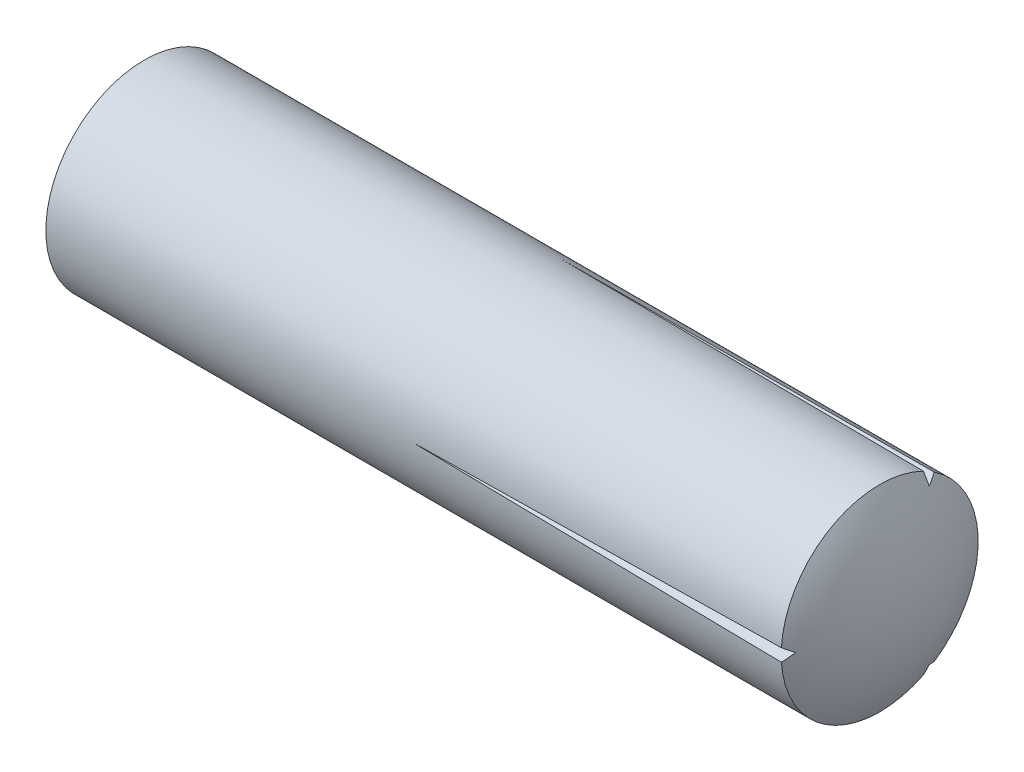
ISO-10303-21;
HEADER;
FILE_DESCRIPTION(('STEP AP214'),'2;1');
FILE_NAME('part.step','',(''),(''),'','','');
FILE_SCHEMA(('AUTOMOTIVE_DESIGN { 1 0 10303 214 1 1 1 1 }'));
ENDSEC;
DATA;
#1=APPLICATION_CONTEXT('core data for automotive mechanical design processes');
#2=APPLICATION_PROTOCOL_DEFINITION('international standard','automotive_design',2000,#1);
#3=PRODUCT_CONTEXT('',#1,'mechanical');
#4=PRODUCT('Part','Part','',(#3));
#5=PRODUCT_RELATED_PRODUCT_CATEGORY('part','',(#4));
#6=PRODUCT_DEFINITION_FORMATION('','',#4);
#7=PRODUCT_DEFINITION_CONTEXT('part definition',#1,'design');
#8=PRODUCT_DEFINITION('design','',#6,#7);
#9=PRODUCT_DEFINITION_SHAPE('','',#8);
#10=(LENGTH_UNIT() NAMED_UNIT(*) SI_UNIT(.MILLI.,.METRE.));
#11=(NAMED_UNIT(*) PLANE_ANGLE_UNIT() SI_UNIT($,.RADIAN.));
#12=(NAMED_UNIT(*) SI_UNIT($,.STERADIAN.) SOLID_ANGLE_UNIT());
#13=UNCERTAINTY_MEASURE_WITH_UNIT(LENGTH_MEASURE(1.E-05),#10,'distance_accuracy_value','');
#14=(GEOMETRIC_REPRESENTATION_CONTEXT(3) GLOBAL_UNCERTAINTY_ASSIGNED_CONTEXT((#13)) GLOBAL_UNIT_ASSIGNED_CONTEXT((#10,
#11,#12)) REPRESENTATION_CONTEXT('',''));
#15=CARTESIAN_POINT('',(0.,0.,0.));
#16=DIRECTION('',(0.,0.,1.));
#17=DIRECTION('',(1.,0.,0.));
#18=AXIS2_PLACEMENT_3D('',#15,#16,#17);
#19=CARTESIAN_POINT('',(-25.,0.,0.));
#20=DIRECTION('',(-1.,0.,0.));
#21=DIRECTION('',(0.,1.,0.));
#22=AXIS2_PLACEMENT_3D('',#19,#20,#21);
#23=SPHERICAL_SURFACE('',#22,25.);
#24=CARTESIAN_POINT('',(-24.9023511934461,6.17179285381206,2.87795427227892));
#25=DIRECTION('',(-0.0143379369105312,-0.906214624486526,-0.422574819330133));
#26=DIRECTION('',(0.,0.422618261740707,-0.906307787036646));
#27=AXIS2_PLACEMENT_3D('',#24,#25,#26);
#28=CIRCLE('',#27,24.0544552398695);
#29=CARTESIAN_POINT('',(-3.34936490538902,10.4038239468317,-6.92895715698489));
#30=VERTEX_POINT('',#29);
#31=CARTESIAN_POINT('',(-2.70853608787133,9.80142731905408,-5.65885670109831));
#32=VERTEX_POINT('',#31);
#33=EDGE_CURVE('E46',#30,#32,#28,.T.);
#34=ORIENTED_EDGE('',*,*,#33,.T.);
#35=CARTESIAN_POINT('',(-24.9023511934461,0.593514916182661,-6.78390653443597));
#36=DIRECTION('',(-0.0143379369105313,-0.0871467837037696,0.996092295751372));
#37=DIRECTION('',(0.,-0.996194698091744,-0.0871557427476708));
#38=AXIS2_PLACEMENT_3D('',#35,#36,#37);
#39=CIRCLE('',#38,24.0544552398695);
#40=CARTESIAN_POINT('',(-3.34936490538905,11.2025648930988,-5.54549725596445));
#41=VERTEX_POINT('',#40);
#42=EDGE_CURVE('E92',#32,#41,#39,.T.);
#43=ORIENTED_EDGE('',*,*,#42,.T.);
#44=CARTESIAN_POINT('',(-3.34936490538904,0.,0.));
#45=DIRECTION('',(-1.,0.,0.));
#46=DIRECTION('',(0.,0.,1.));
#47=AXIS2_PLACEMENT_3D('',#44,#45,#46);
#48=CIRCLE('',#47,12.5);
#49=CARTESIAN_POINT('',(-3.34936490538908,0.798740946267198,12.4744544129495));
#50=VERTEX_POINT('',#49);
#51=EDGE_CURVE('E99',#50,#41,#48,.T.);
#52=ORIENTED_EDGE('',*,*,#51,.F.);
#53=CARTESIAN_POINT('',(-24.9023511934461,-5.5782779376295,3.90595226215709));
#54=DIRECTION('',(-0.0143379369105312,0.819067840782772,-0.573517476421249));
#55=DIRECTION('',(0.,0.573576436351047,0.819152044288991));
#56=AXIS2_PLACEMENT_3D('',#53,#54,#55);
#57=CIRCLE('',#56,24.0544552398695);
#58=CARTESIAN_POINT('',(-2.70853608787132,0.,11.3177134021968));
#59=VERTEX_POINT('',#58);
#60=EDGE_CURVE('E123',#50,#59,#57,.T.);
#61=ORIENTED_EDGE('',*,*,#60,.T.);
#62=CARTESIAN_POINT('',(-24.9023511934461,5.5782779376295,3.90595226215713));
#63=DIRECTION('',(-0.0143379369105313,-0.819067840782771,-0.57351747642125));
#64=DIRECTION('',(0.,0.573576436351049,-0.81915204428899));
#65=AXIS2_PLACEMENT_3D('',#62,#63,#64);
#66=CIRCLE('',#65,24.0544552398695);
#67=CARTESIAN_POINT('',(-3.34936490538905,-0.798740946267202,12.4744544129495));
#68=VERTEX_POINT('',#67);
#69=EDGE_CURVE('E118',#59,#68,#66,.T.);
#70=ORIENTED_EDGE('',*,*,#69,.T.);
#71=CARTESIAN_POINT('',(-3.34936490538905,-11.2025648930988,-5.54549725596461));
#72=VERTEX_POINT('',#71);
#73=EDGE_CURVE('E106',#72,#68,#48,.T.);
#74=ORIENTED_EDGE('',*,*,#73,.F.);
#75=CARTESIAN_POINT('',(-24.9023511934461,-0.593514916182572,-6.78390653443596));
#76=DIRECTION('',(-0.0143379369105312,0.0871467837037535,0.996092295751373));
#77=DIRECTION('',(0.,-0.996194698091746,0.0871557427476547));
#78=AXIS2_PLACEMENT_3D('',#75,#76,#77);
#79=CIRCLE('',#78,24.0544552398695);
#80=CARTESIAN_POINT('',(-2.70853608787131,-9.801427319054,-5.65885670109844));
#81=VERTEX_POINT('',#80);
#82=EDGE_CURVE('E54',#72,#81,#79,.T.);
#83=ORIENTED_EDGE('',*,*,#82,.T.);
#84=CARTESIAN_POINT('',(-24.9023511934461,-6.17179285381213,2.87795427227883));
#85=DIRECTION('',(-0.0143379369105313,0.906214624486533,-0.422574819330118));
#86=DIRECTION('',(0.,0.422618261740692,0.906307787036653));
#87=AXIS2_PLACEMENT_3D('',#84,#85,#86);
#88=CIRCLE('',#87,24.0544552398695);
#89=CARTESIAN_POINT('',(-3.34936490538905,-10.4038239468316,-6.92895715698503));
#90=VERTEX_POINT('',#89);
#91=EDGE_CURVE('E128',#81,#90,#88,.T.);
#92=ORIENTED_EDGE('',*,*,#91,.T.);
#93=EDGE_CURVE('E104',#30,#90,#48,.T.);
#94=ORIENTED_EDGE('',*,*,#93,.F.);
#95=EDGE_LOOP('',(#34,#43,#52,#61,#70,#74,#83,#92,#94));
#96=FACE_BOUND('',#95,.T.);
#97=ADVANCED_FACE('F32',(#96),#23,.T.);
#98=CARTESIAN_POINT('',(-40.,0.,0.));
#99=DIRECTION('',(-1.,0.,0.));
#100=DIRECTION('',(0.,0.,1.));
#101=AXIS2_PLACEMENT_3D('',#98,#99,#100);
#102=CYLINDRICAL_SURFACE('',#101,12.5);
#103=ORIENTED_EDGE('',*,*,#51,.T.);
#104=CARTESIAN_POINT('',(450.,0.,0.));
#105=DIRECTION('',(-0.0143379369105313,-0.0871467837037696,0.996092295751372));
#106=DIRECTION('',(-0.999897206499323,0.0012496335409066,-0.0142833767318452));
#107=AXIS2_PLACEMENT_3D('',#104,#105,#106);
#108=ELLIPSE('',#107,871.813014522243,12.5);
#109=CARTESIAN_POINT('',(-50.,10.8253175473055,-6.2499999999999));
#110=VERTEX_POINT('',#109);
#111=EDGE_CURVE('E11',#41,#110,#108,.T.);
#112=ORIENTED_EDGE('',*,*,#111,.T.);
#113=CARTESIAN_POINT('',(449.999999999999,0.,0.));
#114=DIRECTION('',(-0.0143379369105312,-0.906214624486526,-0.422574819330133));
#115=DIRECTION('',(-0.999897206499323,0.0129945838720546,0.00605947397407663));
#116=AXIS2_PLACEMENT_3D('',#113,#114,#115);
#117=ELLIPSE('',#116,871.813014522245,12.5);
#118=EDGE_CURVE('E39',#110,#30,#117,.T.);
#119=ORIENTED_EDGE('',*,*,#118,.T.);
#120=ORIENTED_EDGE('',*,*,#93,.T.);
#121=CARTESIAN_POINT('',(450.,0.,0.));
#122=DIRECTION('',(-0.0143379369105313,0.906214624486533,-0.422574819330118));
#123=DIRECTION('',(-0.999897206499323,-0.0129945838720548,0.00605947397407644));
#124=AXIS2_PLACEMENT_3D('',#121,#122,#123);
#125=ELLIPSE('',#124,871.813014522242,12.5);
#126=CARTESIAN_POINT('',(-50.,-10.8253175473055,-6.25000000000005));
#127=VERTEX_POINT('',#126);
#128=EDGE_CURVE('E88',#90,#127,#125,.T.);
#129=ORIENTED_EDGE('',*,*,#128,.T.);
#130=CARTESIAN_POINT('',(450.,0.,0.));
#131=DIRECTION('',(-0.0143379369105312,0.0871467837037535,0.996092295751373));
#132=DIRECTION('',(-0.999897206499323,-0.00124963354090636,-0.0142833767318452));
#133=AXIS2_PLACEMENT_3D('',#130,#131,#132);
#134=ELLIPSE('',#133,871.813014522245,12.5);
#135=EDGE_CURVE('E140',#127,#72,#134,.T.);
#136=ORIENTED_EDGE('',*,*,#135,.T.);
#137=ORIENTED_EDGE('',*,*,#73,.T.);
#138=CARTESIAN_POINT('',(450.,0.,0.));
#139=DIRECTION('',(-0.0143379369105313,-0.819067840782771,-0.57351747642125));
#140=DIRECTION('',(-0.999897206499323,0.0117449503311483,0.00822390275776869));
#141=AXIS2_PLACEMENT_3D('',#138,#139,#140);
#142=ELLIPSE('',#141,871.813014522242,12.5);
#143=CARTESIAN_POINT('',(-50.,0.,12.5));
#144=VERTEX_POINT('',#143);
#145=EDGE_CURVE('E107',#68,#144,#142,.T.);
#146=ORIENTED_EDGE('',*,*,#145,.T.);
#147=CARTESIAN_POINT('',(450.,0.,0.));
#148=DIRECTION('',(-0.0143379369105312,0.819067840782772,-0.573517476421249));
#149=DIRECTION('',(-0.999897206499323,-0.0117449503311482,0.00822390275776864));
#150=AXIS2_PLACEMENT_3D('',#147,#148,#149);
#151=ELLIPSE('',#150,871.813014522245,12.5);
#152=EDGE_CURVE('E101',#144,#50,#151,.T.);
#153=ORIENTED_EDGE('',*,*,#152,.T.);
#154=EDGE_LOOP('',(#103,#112,#119,#120,#129,#136,#137,#146,#153));
#155=FACE_BOUND('',#154,.T.);
#156=CARTESIAN_POINT('',(-96.6819046503132,0.,0.));
#157=DIRECTION('',(-1.,0.,0.));
#158=DIRECTION('',(0.,0.,1.));
#159=AXIS2_PLACEMENT_3D('',#156,#157,#158);
#160=CIRCLE('',#159,12.5);
#161=CARTESIAN_POINT('',(-96.6819046503132,12.5,0.));
#162=VERTEX_POINT('',#161);
#163=EDGE_CURVE('E110',#162,#162,#160,.T.);
#164=ORIENTED_EDGE('',*,*,#163,.F.);
#165=EDGE_LOOP('',(#164));
#166=FACE_BOUND('',#165,.T.);
#167=ADVANCED_FACE('F95',(#155,#166),#102,.T.);
#168=CARTESIAN_POINT('',(-75.0312695557023,0.,0.));
#169=DIRECTION('',(-1.,0.,0.));
#170=DIRECTION('',(0.,1.,0.));
#171=AXIS2_PLACEMENT_3D('',#168,#169,#170);
#172=SPHERICAL_SURFACE('',#171,25.);
#173=CARTESIAN_POINT('',(-100.,0.,0.));
#174=DIRECTION('',(-1.,0.,0.));
#175=DIRECTION('',(0.,0.,1.));
#176=AXIS2_PLACEMENT_3D('',#173,#174,#175);
#177=CIRCLE('',#176,1.25);
#178=CARTESIAN_POINT('',(-100.,1.25000000000035,0.));
#179=VERTEX_POINT('',#178);
#180=EDGE_CURVE('E114',#179,#179,#177,.T.);
#181=CARTESIAN_POINT('',(-100.,1.25000000000035,0.));
#182=CARTESIAN_POINT('',(-99.9938336924778,1.37317333168672,0.));
#183=CARTESIAN_POINT('',(-99.9867558041352,1.4963010254091,0.));
#184=CARTESIAN_POINT('',(-99.9707787305738,1.74243819046368,0.));
#185=CARTESIAN_POINT('',(-99.9618795453548,1.86544766179588,0.));
#186=CARTESIAN_POINT('',(-99.942261742805,2.11132143560789,0.));
#187=CARTESIAN_POINT('',(-99.931543125474,2.23418573808771,0.));
#188=CARTESIAN_POINT('',(-99.9082888288313,2.47974226646491,0.));
#189=CARTESIAN_POINT('',(-99.8957531495194,2.60243449236229,0.));
#190=CARTESIAN_POINT('',(-99.8688674683718,2.84761999567298,0.));
#191=CARTESIAN_POINT('',(-99.854517466536,2.9701132730863,0.));
#192=CARTESIAN_POINT('',(-99.8240062848361,3.2148740515982,0.));
#193=CARTESIAN_POINT('',(-99.8078451049719,3.33714155269677,0.));
#194=CARTESIAN_POINT('',(-99.7737151063308,3.58142400006358,0.));
#195=CARTESIAN_POINT('',(-99.7557462875539,3.7034389463318,0.));
#196=CARTESIAN_POINT('',(-99.718004946655,3.94718956087147,0.));
#197=CARTESIAN_POINT('',(-99.698232424533,4.06892522914292,0.));
#198=CARTESIAN_POINT('',(-99.6568880074031,4.31209062567928,0.));
#199=CARTESIAN_POINT('',(-99.6353161123952,4.43352035394419,0.));
#200=CARTESIAN_POINT('',(-99.5903776740829,4.67604727546591,0.));
#201=CARTESIAN_POINT('',(-99.5670111307785,4.79714446872271,0.));
#202=CARTESIAN_POINT('',(-99.5184885135078,5.0389797980563,0.));
#203=CARTESIAN_POINT('',(-99.4933324395417,5.15971793413308,0.));
#204=CARTESIAN_POINT('',(-99.4412362705202,5.40080870557401,0.));
#205=CARTESIAN_POINT('',(-99.4142961754649,5.52116134093816,0.));
#206=CARTESIAN_POINT('',(-99.3586378645657,5.76145475185184,0.));
#207=CARTESIAN_POINT('',(-99.3299196487216,5.88139552740136,0.));
#208=CARTESIAN_POINT('',(-99.2707113859815,6.1208389497875,0.));
#209=CARTESIAN_POINT('',(-99.2402213390854,6.24034159662412,0.));
#210=CARTESIAN_POINT('',(-99.1774760920363,6.4788825886432,0.));
#211=CARTESIAN_POINT('',(-99.1452208918834,6.59792093382565,0.));
#212=CARTESIAN_POINT('',(-99.078952402712,6.83550725128444,0.));
#213=CARTESIAN_POINT('',(-99.0449391136935,6.95405522356077,0.));
#214=CARTESIAN_POINT('',(-98.9751618962311,7.19063483135464,0.));
#215=CARTESIAN_POINT('',(-98.9393979677872,7.30866646687218,0.));
#216=CARTESIAN_POINT('',(-98.8661273043316,7.54418755038161,0.));
#217=CARTESIAN_POINT('',(-98.8286205693198,7.6616769983735,0.));
#218=CARTESIAN_POINT('',(-98.7518725072874,7.89608797481227,0.));
#219=CARTESIAN_POINT('',(-98.7126311802669,8.01300950325915,0.));
#220=CARTESIAN_POINT('',(-98.6324225286792,8.24625903297179,0.));
#221=CARTESIAN_POINT('',(-98.5914552041119,8.36258703423754,0.));
#222=CARTESIAN_POINT('',(-98.5078035299129,8.59462403194348,0.));
#223=CARTESIAN_POINT('',(-98.4651191802811,8.71033302838366,0.));
#224=CARTESIAN_POINT('',(-98.3780428044906,8.94110667436581,0.));
#225=CARTESIAN_POINT('',(-98.3336507783319,9.05617132390777,0.));
#226=CARTESIAN_POINT('',(-98.2431687720324,9.28563107514246,0.));
#227=CARTESIAN_POINT('',(-98.1970787918916,9.40002617683519,0.));
#228=CARTESIAN_POINT('',(-98.1032109720533,9.62812177806321,0.));
#229=CARTESIAN_POINT('',(-98.055433132356,9.74182227759849,0.));
#230=CARTESIAN_POINT('',(-97.9582000574885,9.96850377232692,0.));
#231=CARTESIAN_POINT('',(-97.9087448223184,10.0814847675201,0.));
#232=CARTESIAN_POINT('',(-97.8081677879997,10.3067025089815,0.));
#233=CARTESIAN_POINT('',(-97.7570459888512,10.4189392552497,0.));
#234=CARTESIAN_POINT('',(-97.653147022944,10.6426439172087,0.));
#235=CARTESIAN_POINT('',(-97.6003698561855,10.7541118328994,0.));
#236=CARTESIAN_POINT('',(-97.4931717144603,10.9762544207054,0.));
#237=CARTESIAN_POINT('',(-97.4387507394937,11.0869290928207,0.));
#238=CARTESIAN_POINT('',(-97.3282768989746,11.307460953207,0.));
#239=CARTESIAN_POINT('',(-97.272224033422,11.417318141478,0.));
#240=CARTESIAN_POINT('',(-97.1584986934783,11.6361909766945,0.));
#241=CARTESIAN_POINT('',(-97.1008262190871,11.74520662364,0.));
#242=CARTESIAN_POINT('',(-96.9838742728691,11.9623724890546,0.));
#243=CARTESIAN_POINT('',(-96.9245948010422,12.0705227075237,0.));
#244=CARTESIAN_POINT('',(-96.8044419168537,12.2859340705523,0.));
#245=CARTESIAN_POINT('',(-96.743568504492,12.3931952151119,0.));
#246=CARTESIAN_POINT('',(-96.6819046503132,12.5,0.));
#247=B_SPLINE_CURVE_WITH_KNOTS('',3,(#181,#182,#183,#184,#185,#186,#187,#188,#189,#190,#191,
#192,#193,#194,#195,#196,#197,#198,#199,#200,#201,#202,#203,#204,#205,#206,#207,#208,#209,#210,
#211,#212,#213,#214,#215,#216,#217,#218,#219,#220,#221,#222,#223,#224,#225,#226,#227,#228,#229,
#230,#231,#232,#233,#234,#235,#236,#237,#238,#239,#240,#241,#242,#243,#244,#245,#246),
.UNSPECIFIED.,.F.,.F.,(4,2,2,2,2,2,2,2,2,2,2,2,2,2,2,2,2,2,2,2,2,2,2,2,2,2,2,2,2,2,2,2,4),(0.,
0.369979372671537,0.739958745343075,1.10993811801462,1.47991749068616,1.84989686335769,
2.21987623602923,2.58985560870077,2.95983498137231,3.32981435404385,3.69979372671539,
4.06977309938693,4.43975247205846,4.80973184473,5.17971121740154,5.54969059007308,
5.91966996274462,6.28964933541616,6.6596287080877,7.02960808075924,7.39958745343078,
7.76956682610231,8.13954619877385,8.50952557144539,8.87950494411693,9.24948431678847,
9.61946368946001,9.98944306213155,10.3594224348031,10.7294018074746,11.0993811801462,
11.4693605528177,11.8393399254892),.UNSPECIFIED.);
#248=EDGE_CURVE('BSEAM163',#179,#162,#247,.T.);
#249=ORIENTED_EDGE('',*,*,#180,.F.);
#250=ORIENTED_EDGE('',*,*,#163,.T.);
#251=ORIENTED_EDGE('',*,*,#248,.T.);
#252=ORIENTED_EDGE('',*,*,#248,.F.);
#253=EDGE_LOOP('',(#249,#251,#250,#252));
#254=FACE_BOUND('',#253,.T.);
#255=ADVANCED_FACE('F163',(#254),#172,.T.);
#256=CARTESIAN_POINT('',(-100.,0.,0.));
#257=DIRECTION('',(1.,0.,0.));
#258=DIRECTION('',(0.,0.,-1.));
#259=AXIS2_PLACEMENT_3D('',#256,#257,#258);
#260=PLANE('',#259);
#261=ORIENTED_EDGE('',*,*,#180,.T.);
#262=EDGE_LOOP('',(#261));
#263=FACE_BOUND('',#262,.T.);
#264=ADVANCED_FACE('F157',(#263),#260,.F.);
#265=CARTESIAN_POINT('',(-50.,0.,12.5));
#266=DIRECTION('',(-0.0143379369105313,-0.819067840782771,-0.57351747642125));
#267=DIRECTION('',(0.,0.573576436351049,-0.81915204428899));
#268=AXIS2_PLACEMENT_3D('',#265,#266,#267);
#269=PLANE('',#268);
#270=DIRECTION('',(0.999687646408123,0.,-0.0249921911602031));
#271=VECTOR('',#270,1.);
#272=CARTESIAN_POINT('',(-50.,0.,12.5));
#273=LINE('',#272,#271);
#274=EDGE_CURVE('E125',#144,#59,#273,.T.);
#275=ORIENTED_EDGE('',*,*,#274,.F.);
#276=ORIENTED_EDGE('',*,*,#145,.F.);
#277=ORIENTED_EDGE('',*,*,#69,.F.);
#278=EDGE_LOOP('',(#275,#276,#277));
#279=FACE_BOUND('',#278,.T.);
#280=ADVANCED_FACE('F146',(#279),#269,.F.);
#281=CARTESIAN_POINT('',(-50.,0.,12.5));
#282=DIRECTION('',(-0.0143379369105312,0.819067840782772,-0.573517476421249));
#283=DIRECTION('',(0.,0.573576436351047,0.819152044288991));
#284=AXIS2_PLACEMENT_3D('',#281,#282,#283);
#285=PLANE('',#284);
#286=ORIENTED_EDGE('',*,*,#152,.F.);
#287=ORIENTED_EDGE('',*,*,#274,.T.);
#288=ORIENTED_EDGE('',*,*,#60,.F.);
#289=EDGE_LOOP('',(#286,#287,#288));
#290=FACE_BOUND('',#289,.T.);
#291=ADVANCED_FACE('F148',(#290),#285,.F.);
#292=CARTESIAN_POINT('',(-50.,-10.8253175473055,-6.25000000000005));
#293=DIRECTION('',(-0.0143379369105313,0.906214624486533,-0.422574819330118));
#294=DIRECTION('',(0.,0.422618261740692,0.906307787036653));
#295=AXIS2_PLACEMENT_3D('',#292,#293,#294);
#296=PLANE('',#295);
#297=DIRECTION('',(0.999687646408123,0.0216438724409727,0.0124960955801016));
#298=VECTOR('',#297,1.);
#299=CARTESIAN_POINT('',(-50.,-10.8253175473055,-6.25000000000005));
#300=LINE('',#299,#298);
#301=EDGE_CURVE('E132',#127,#81,#300,.T.);
#302=ORIENTED_EDGE('',*,*,#301,.F.);
#303=ORIENTED_EDGE('',*,*,#128,.F.);
#304=ORIENTED_EDGE('',*,*,#91,.F.);
#305=EDGE_LOOP('',(#302,#303,#304));
#306=FACE_BOUND('',#305,.T.);
#307=ADVANCED_FACE('F139',(#306),#296,.F.);
#308=CARTESIAN_POINT('',(-50.,-10.8253175473055,-6.25000000000005));
#309=DIRECTION('',(-0.0143379369105312,0.0871467837037535,0.996092295751373));
#310=DIRECTION('',(0.,-0.996194698091746,0.0871557427476547));
#311=AXIS2_PLACEMENT_3D('',#308,#309,#310);
#312=PLANE('',#311);
#313=ORIENTED_EDGE('',*,*,#135,.F.);
#314=ORIENTED_EDGE('',*,*,#301,.T.);
#315=ORIENTED_EDGE('',*,*,#82,.F.);
#316=EDGE_LOOP('',(#313,#314,#315));
#317=FACE_BOUND('',#316,.T.);
#318=ADVANCED_FACE('F155',(#317),#312,.F.);
#319=CARTESIAN_POINT('',(-50.,10.8253175473055,-6.2499999999999));
#320=DIRECTION('',(-0.0143379369105313,-0.0871467837037696,0.996092295751372));
#321=DIRECTION('',(0.,-0.996194698091744,-0.0871557427476708));
#322=AXIS2_PLACEMENT_3D('',#319,#320,#321);
#323=PLANE('',#322);
#324=DIRECTION('',(0.999687646408123,-0.0216438724409729,0.0124960955801013));
#325=VECTOR('',#324,1.);
#326=CARTESIAN_POINT('',(-50.,10.8253175473055,-6.2499999999999));
#327=LINE('',#326,#325);
#328=EDGE_CURVE('E85',#110,#32,#327,.T.);
#329=ORIENTED_EDGE('',*,*,#328,.F.);
#330=ORIENTED_EDGE('',*,*,#111,.F.);
#331=ORIENTED_EDGE('',*,*,#42,.F.);
#332=EDGE_LOOP('',(#329,#330,#331));
#333=FACE_BOUND('',#332,.T.);
#334=ADVANCED_FACE('F90',(#333),#323,.F.);
#335=CARTESIAN_POINT('',(-50.,10.8253175473055,-6.2499999999999));
#336=DIRECTION('',(-0.0143379369105312,-0.906214624486526,-0.422574819330133));
#337=DIRECTION('',(0.,0.422618261740707,-0.906307787036646));
#338=AXIS2_PLACEMENT_3D('',#335,#336,#337);
#339=PLANE('',#338);
#340=ORIENTED_EDGE('',*,*,#118,.F.);
#341=ORIENTED_EDGE('',*,*,#328,.T.);
#342=ORIENTED_EDGE('',*,*,#33,.F.);
#343=EDGE_LOOP('',(#340,#341,#342));
#344=FACE_BOUND('',#343,.T.);
#345=ADVANCED_FACE('F84',(#344),#339,.F.);
#346=CLOSED_SHELL('',(#97,#167,#255,#264,#280,#291,#307,#318,#334,#345));
#347=MANIFOLD_SOLID_BREP('B2',#346);
#348=ADVANCED_BREP_SHAPE_REPRESENTATION('',(#18,#347),#14);
#349=SHAPE_DEFINITION_REPRESENTATION(#9,#348);
ENDSEC;
END-ISO-10303-21;
